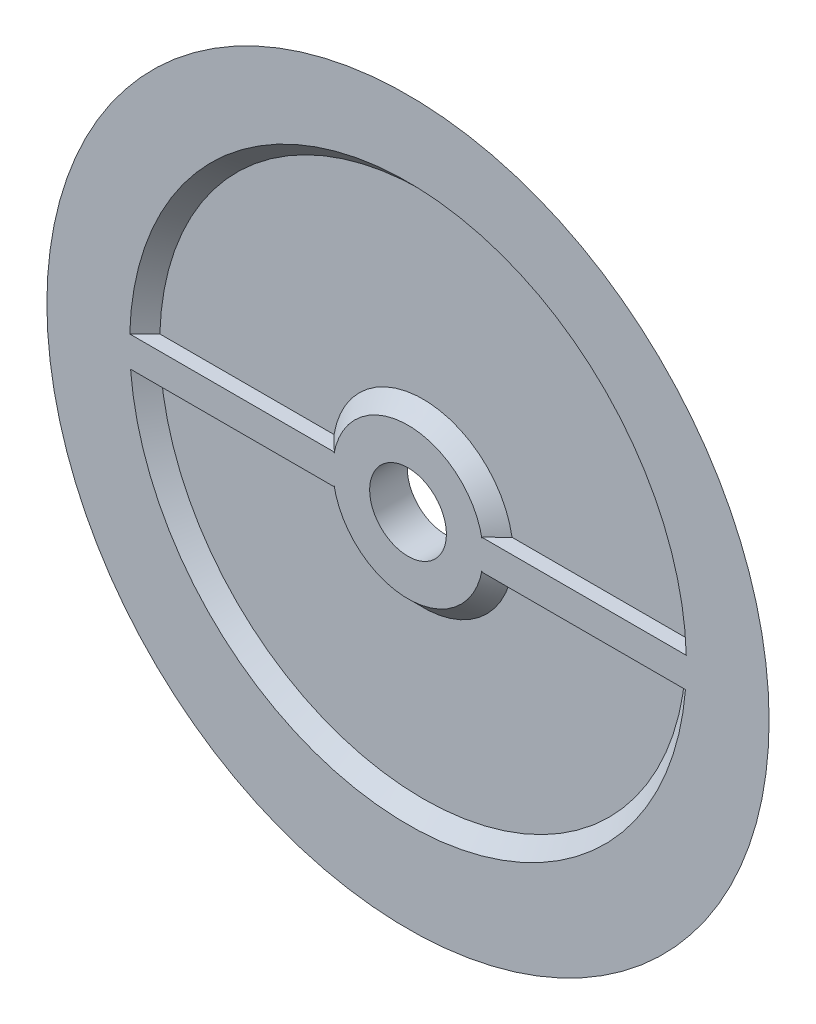
ISO-10303-21;
HEADER;
FILE_DESCRIPTION(('STEP AP214'),'2;1');
FILE_NAME('part.step','',(''),(''),'','','');
FILE_SCHEMA(('AUTOMOTIVE_DESIGN { 1 0 10303 214 1 1 1 1 }'));
ENDSEC;
DATA;
#1=APPLICATION_CONTEXT('core data for automotive mechanical design processes');
#2=APPLICATION_PROTOCOL_DEFINITION('international standard','automotive_design',2000,#1);
#3=PRODUCT_CONTEXT('',#1,'mechanical');
#4=PRODUCT('Part','Part','',(#3));
#5=PRODUCT_RELATED_PRODUCT_CATEGORY('part','',(#4));
#6=PRODUCT_DEFINITION_FORMATION('','',#4);
#7=PRODUCT_DEFINITION_CONTEXT('part definition',#1,'design');
#8=PRODUCT_DEFINITION('design','',#6,#7);
#9=PRODUCT_DEFINITION_SHAPE('','',#8);
#10=(LENGTH_UNIT() NAMED_UNIT(*) SI_UNIT(.MILLI.,.METRE.));
#11=(NAMED_UNIT(*) PLANE_ANGLE_UNIT() SI_UNIT($,.RADIAN.));
#12=(NAMED_UNIT(*) SI_UNIT($,.STERADIAN.) SOLID_ANGLE_UNIT());
#13=UNCERTAINTY_MEASURE_WITH_UNIT(LENGTH_MEASURE(1.E-05),#10,'distance_accuracy_value','');
#14=(GEOMETRIC_REPRESENTATION_CONTEXT(3) GLOBAL_UNCERTAINTY_ASSIGNED_CONTEXT((#13)) GLOBAL_UNIT_ASSIGNED_CONTEXT((#10,
#11,#12)) REPRESENTATION_CONTEXT('',''));
#15=CARTESIAN_POINT('',(0.,0.,0.));
#16=DIRECTION('',(0.,0.,1.));
#17=DIRECTION('',(1.,0.,0.));
#18=AXIS2_PLACEMENT_3D('',#15,#16,#17);
#19=CARTESIAN_POINT('',(0.,0.990500037260635,3.));
#20=DIRECTION('',(0.,0.,1.));
#21=DIRECTION('',(1.,0.,0.));
#22=AXIS2_PLACEMENT_3D('',#19,#20,#21);
#23=PLANE('',#22);
#24=CARTESIAN_POINT('',(0.,0.,3.));
#25=DIRECTION('',(0.,0.,1.));
#26=DIRECTION('',(1.,0.,0.));
#27=AXIS2_PLACEMENT_3D('',#24,#25,#26);
#28=CIRCLE('',#27,12.);
#29=CARTESIAN_POINT('',(11.8321595661992,2.,3.));
#30=VERTEX_POINT('',#29);
#31=CARTESIAN_POINT('',(-11.8321595661992,2.,3.));
#32=VERTEX_POINT('',#31);
#33=EDGE_CURVE('E260',#30,#32,#28,.T.);
#34=ORIENTED_EDGE('',*,*,#33,.F.);
#35=DIRECTION('',(-1.,0.,0.));
#36=VECTOR('',#35,1.);
#37=CARTESIAN_POINT('',(40.1870522877006,2.,3.));
#38=LINE('',#37,#36);
#39=CARTESIAN_POINT('',(34.9854385398444,2.,3.));
#40=VERTEX_POINT('',#39);
#41=EDGE_CURVE('E261',#40,#30,#38,.T.);
#42=ORIENTED_EDGE('',*,*,#41,.F.);
#43=CARTESIAN_POINT('',(0.,0.990500037260635,3.));
#44=DIRECTION('',(0.,0.,1.));
#45=DIRECTION('',(1.,0.,0.));
#46=AXIS2_PLACEMENT_3D('',#43,#44,#45);
#47=CIRCLE('',#46,35.);
#48=CARTESIAN_POINT('',(-34.9854385398444,2.,3.));
#49=VERTEX_POINT('',#48);
#50=EDGE_CURVE('E275',#40,#49,#47,.T.);
#51=ORIENTED_EDGE('',*,*,#50,.T.);
#52=DIRECTION('',(-1.,0.,0.));
#53=VECTOR('',#52,1.);
#54=CARTESIAN_POINT('',(-40.1870522877006,2.,3.));
#55=LINE('',#54,#53);
#56=EDGE_CURVE('E264',#32,#49,#55,.T.);
#57=ORIENTED_EDGE('',*,*,#56,.F.);
#58=EDGE_LOOP('',(#34,#42,#51,#57));
#59=FACE_BOUND('',#58,.T.);
#60=ADVANCED_FACE('F42',(#59),#23,.T.);
#61=DIRECTION('',(1.,0.,0.));
#62=VECTOR('',#61,1.);
#63=CARTESIAN_POINT('',(40.1870522877006,-2.,3.));
#64=LINE('',#63,#62);
#65=CARTESIAN_POINT('',(11.8321595661992,-2.,3.));
#66=VERTEX_POINT('',#65);
#67=CARTESIAN_POINT('',(34.8720075350867,-2.,3.));
#68=VERTEX_POINT('',#67);
#69=EDGE_CURVE('E149',#66,#68,#64,.T.);
#70=ORIENTED_EDGE('',*,*,#69,.F.);
#71=CARTESIAN_POINT('',(-11.8321595661992,-2.,3.));
#72=VERTEX_POINT('',#71);
#73=EDGE_CURVE('E266',#72,#66,#28,.T.);
#74=ORIENTED_EDGE('',*,*,#73,.F.);
#75=DIRECTION('',(1.,0.,0.));
#76=VECTOR('',#75,1.);
#77=CARTESIAN_POINT('',(0.,-2.,3.));
#78=LINE('',#77,#76);
#79=CARTESIAN_POINT('',(-34.8720075350867,-2.,3.));
#80=VERTEX_POINT('',#79);
#81=EDGE_CURVE('E298',#80,#72,#78,.T.);
#82=ORIENTED_EDGE('',*,*,#81,.F.);
#83=EDGE_CURVE('E271',#80,#68,#47,.T.);
#84=ORIENTED_EDGE('',*,*,#83,.T.);
#85=EDGE_LOOP('',(#70,#74,#82,#84));
#86=FACE_BOUND('',#85,.T.);
#87=ADVANCED_FACE('F252',(#86),#23,.T.);
#88=CARTESIAN_POINT('',(0.,0.,5.));
#89=DIRECTION('',(0.,0.,-1.));
#90=DIRECTION('',(1.,0.,0.));
#91=AXIS2_PLACEMENT_3D('',#88,#89,#90);
#92=CONICAL_SURFACE('',#91,10.,0.78539816339745);
#93=CARTESIAN_POINT('',(9.86606874731853,2.0007,4.93311800919394));
#94=CARTESIAN_POINT('',(9.86606874731853,1.87762100868135,4.95758139565382));
#95=CARTESIAN_POINT('',(9.86606874731853,1.7541331534907,4.97995191513057));
#96=CARTESIAN_POINT('',(9.86606874731853,1.50643487696366,5.02033423720103));
#97=CARTESIAN_POINT('',(9.86606874731853,1.38222438365299,5.03834559774242));
#98=CARTESIAN_POINT('',(9.86606874731853,1.00862713496209,5.0855824427051));
#99=CARTESIAN_POINT('',(9.86606874731853,0.758336164556195,5.10799830172327));
#100=CARTESIAN_POINT('',(9.86606874731853,0.260412570286895,5.13358357055511));
#101=CARTESIAN_POINT('',(9.86606874731853,0.0127936349844117,5.13702576053642));
#102=CARTESIAN_POINT('',(9.86606874731853,-0.481912365436169,5.12526103757676));
#103=CARTESIAN_POINT('',(9.86606874731853,-0.728999631073088,5.11006322041137));
#104=CARTESIAN_POINT('',(9.86606874731853,-1.06094967246736,5.07741962632327));
#105=CARTESIAN_POINT('',(9.86606874731853,-1.14665132476625,5.06788550236831));
#106=CARTESIAN_POINT('',(9.86606874731853,-1.3177811234612,5.04667566929113));
#107=CARTESIAN_POINT('',(9.86606874731853,-1.4032093017906,5.03500022023669));
#108=CARTESIAN_POINT('',(9.86606874731853,-1.65990219900183,4.99670985052405));
#109=CARTESIAN_POINT('',(9.86606874731853,-1.83070025528273,4.96691781238347));
#110=CARTESIAN_POINT('',(9.86606874731853,-2.0007,4.93311800919394));
#111=B_SPLINE_CURVE_WITH_KNOTS('',3,(#93,#94,#95,#96,#97,#98,#99,#100,#101,#102,#103,#104,#105,
#106,#107,#108,#109,#110),.UNSPECIFIED.,.F.,.F.,(4,2,2,2,2,2,2,2,4),(0.,0.376424725914337,
0.752887608217759,1.50600130008476,2.24825884012315,2.99015432435953,3.24882739921132,
3.50746907853298,4.02738740673174),.UNSPECIFIED.);
#112=CARTESIAN_POINT('',(9.86606874731853,2.,4.93325710436512));
#113=VERTEX_POINT('',#112);
#114=CARTESIAN_POINT('',(9.86606874731853,1.6311613878414,5.));
#115=VERTEX_POINT('',#114);
#116=EDGE_CURVE('E63',#113,#115,#111,.T.);
#117=ORIENTED_EDGE('',*,*,#116,.F.);
#118=CARTESIAN_POINT('',(6.94120422105731,2.,7.7764056011966));
#119=CARTESIAN_POINT('',(7.19546885130194,2.,7.53205034493387));
#120=CARTESIAN_POINT('',(7.44924991959591,2.,7.28719342031385));
#121=CARTESIAN_POINT('',(7.95604024694275,2.,6.79668377558951));
#122=CARTESIAN_POINT('',(8.20904950880184,2.,6.55103105838535));
#123=CARTESIAN_POINT('',(8.71449120418471,2.,6.05913771126599));
#124=CARTESIAN_POINT('',(8.96692364267012,2.,5.81289708644531));
#125=CARTESIAN_POINT('',(9.47133536064413,2.,5.31995169581107));
#126=CARTESIAN_POINT('',(9.723314639656,2.,5.0732469295098));
#127=CARTESIAN_POINT('',(10.478711340777,2.,4.332595092473));
#128=CARTESIAN_POINT('',(10.9815947907177,2.,3.83810350009271));
#129=CARTESIAN_POINT('',(11.9864249485371,2.,2.8481681249572));
#130=CARTESIAN_POINT('',(12.4883716544895,2.,2.35272434024796));
#131=CARTESIAN_POINT('',(13.2902421104832,2.,1.56019124084595));
#132=CARTESIAN_POINT('',(13.5903770049907,2.,1.26331550036275));
#133=CARTESIAN_POINT('',(14.1904516816206,2.,0.669364668411167));
#134=CARTESIAN_POINT('',(14.4903914630176,2.,0.372289576210017));
#135=CARTESIAN_POINT('',(14.7902529095094,2.,0.0751354737387822));
#136=B_SPLINE_CURVE_WITH_KNOTS('',3,(#118,#119,#120,#121,#122,#123,#124,#125,#126,#127,#128,
#129,#130,#131,#132,#133,#134,#135),.UNSPECIFIED.,.F.,.F.,(4,2,2,2,2,2,2,2,4),(0.,
1.0579391871005,2.1158745230247,3.17380072441809,4.23172803808931,6.34755265226564,
8.46338161301056,9.72985120305247,10.9963254741789),.UNSPECIFIED.);
#137=EDGE_CURVE('E159',#113,#30,#136,.T.);
#138=ORIENTED_EDGE('',*,*,#137,.T.);
#139=ORIENTED_EDGE('',*,*,#33,.T.);
#140=CARTESIAN_POINT('',(-14.7902529095094,2.,0.0751354737387808));
#141=CARTESIAN_POINT('',(-14.4648057626749,2.,0.397645870526155));
#142=CARTESIAN_POINT('',(-14.1392651718074,2.,0.720061904083509));
#143=CARTESIAN_POINT('',(-13.4879485918217,2.,1.36465661173277));
#144=CARTESIAN_POINT('',(-13.1621726025211,2.,1.68683528564031));
#145=CARTESIAN_POINT('',(-12.1844273564708,2.,2.65293383377169));
#146=CARTESIAN_POINT('',(-11.5320330080341,2.,3.29642398208027));
#147=CARTESIAN_POINT('',(-10.5520463287102,2.,4.26024876107751));
#148=CARTESIAN_POINT('',(-10.225149598952,2.,4.58129054689983));
#149=CARTESIAN_POINT('',(-9.57073689132727,2.,5.22274149076365));
#150=CARTESIAN_POINT('',(-9.24322091446114,2.,5.54315064982546));
#151=CARTESIAN_POINT('',(-8.5873501322931,2.,6.1831178250344));
#152=CARTESIAN_POINT('',(-8.25899531702639,2.,6.50267583097744));
#153=CARTESIAN_POINT('',(-7.76558220964641,2.,6.98110629424619));
#154=CARTESIAN_POINT('',(-7.60096391153486,2.,7.14043245583454));
#155=CARTESIAN_POINT('',(-7.27136895911861,2.,7.45871415821596));
#156=CARTESIAN_POINT('',(-7.10639230424502,2.,7.61766969841981));
#157=CARTESIAN_POINT('',(-6.9412042210573,2.,7.7764056011966));
#158=B_SPLINE_CURVE_WITH_KNOTS('',3,(#140,#141,#142,#143,#144,#145,#146,#147,#148,#149,#150,
#151,#152,#153,#154,#155,#156,#157),.UNSPECIFIED.,.F.,.F.,(4,2,2,2,2,2,2,2,4),(0.,
1.37453949503144,2.74908005661718,5.49812816919584,6.87266881774801,8.24720724761188,
9.6217620826709,10.3090432330112,10.9963254752235),.UNSPECIFIED.);
#159=CARTESIAN_POINT('',(-9.86606874731853,2.,4.93325710436512));
#160=VERTEX_POINT('',#159);
#161=EDGE_CURVE('E329',#32,#160,#158,.T.);
#162=ORIENTED_EDGE('',*,*,#161,.T.);
#163=CARTESIAN_POINT('',(-9.86606874731853,-2.0007,4.93311800919394));
#164=CARTESIAN_POINT('',(-9.86606874731853,-1.87762100868135,4.95758139565382));
#165=CARTESIAN_POINT('',(-9.86606874731853,-1.7541331534907,4.97995191513057));
#166=CARTESIAN_POINT('',(-9.86606874731853,-1.50643487696366,5.02033423720103));
#167=CARTESIAN_POINT('',(-9.86606874731853,-1.38222438365299,5.03834559774242));
#168=CARTESIAN_POINT('',(-9.86606874731853,-1.00862713496209,5.0855824427051));
#169=CARTESIAN_POINT('',(-9.86606874731853,-0.758336164556195,5.10799830172327));
#170=CARTESIAN_POINT('',(-9.86606874731853,-0.260412570286895,5.13358357055511));
#171=CARTESIAN_POINT('',(-9.86606874731853,-0.0127936349844117,5.13702576053642));
#172=CARTESIAN_POINT('',(-9.86606874731853,0.481912365436169,5.12526103757676));
#173=CARTESIAN_POINT('',(-9.86606874731853,0.728999631073088,5.11006322041137));
#174=CARTESIAN_POINT('',(-9.86606874731853,1.06094967246736,5.07741962632327));
#175=CARTESIAN_POINT('',(-9.86606874731853,1.14665132476625,5.06788550236831));
#176=CARTESIAN_POINT('',(-9.86606874731853,1.3177811234612,5.04667566929113));
#177=CARTESIAN_POINT('',(-9.86606874731853,1.4032093017906,5.03500022023669));
#178=CARTESIAN_POINT('',(-9.86606874731853,1.65990219900183,4.99670985052405));
#179=CARTESIAN_POINT('',(-9.86606874731853,1.83070025528273,4.96691781238347));
#180=CARTESIAN_POINT('',(-9.86606874731853,2.0007,4.93311800919394));
#181=B_SPLINE_CURVE_WITH_KNOTS('',3,(#163,#164,#165,#166,#167,#168,#169,#170,#171,#172,#173,
#174,#175,#176,#177,#178,#179,#180),.UNSPECIFIED.,.F.,.F.,(4,2,2,2,2,2,2,2,4),(0.,
0.376424725914337,0.752887608217759,1.50600130008476,2.24825884012315,2.99015432435953,
3.24882739921132,3.50746907853298,4.02738740673174),.UNSPECIFIED.);
#182=CARTESIAN_POINT('',(-9.86606874731853,1.6311613878414,5.));
#183=VERTEX_POINT('',#182);
#184=EDGE_CURVE('E204',#183,#160,#181,.T.);
#185=ORIENTED_EDGE('',*,*,#184,.F.);
#186=CARTESIAN_POINT('',(0.,0.,5.));
#187=DIRECTION('',(0.,0.,1.));
#188=DIRECTION('',(1.,0.,0.));
#189=AXIS2_PLACEMENT_3D('',#186,#187,#188);
#190=CIRCLE('',#189,10.);
#191=EDGE_CURVE('E238',#115,#183,#190,.T.);
#192=ORIENTED_EDGE('',*,*,#191,.F.);
#193=EDGE_LOOP('',(#117,#138,#139,#162,#185,#192));
#194=FACE_BOUND('',#193,.T.);
#195=ADVANCED_FACE('F179',(#194),#92,.T.);
#196=ORIENTED_EDGE('',*,*,#73,.T.);
#197=CARTESIAN_POINT('',(14.7902529095094,-2.,0.0751354737387808));
#198=CARTESIAN_POINT('',(14.4648057626749,-2.,0.397645870526155));
#199=CARTESIAN_POINT('',(14.1392651718074,-2.,0.720061904083509));
#200=CARTESIAN_POINT('',(13.4879485918217,-2.,1.36465661173277));
#201=CARTESIAN_POINT('',(13.1621726025211,-2.,1.68683528564031));
#202=CARTESIAN_POINT('',(12.1844273564708,-2.,2.65293383377169));
#203=CARTESIAN_POINT('',(11.5320330080341,-2.,3.29642398208027));
#204=CARTESIAN_POINT('',(10.5520463287102,-2.,4.26024876107751));
#205=CARTESIAN_POINT('',(10.225149598952,-2.,4.58129054689983));
#206=CARTESIAN_POINT('',(9.57073689132727,-2.,5.22274149076365));
#207=CARTESIAN_POINT('',(9.24322091446114,-2.,5.54315064982546));
#208=CARTESIAN_POINT('',(8.5873501322931,-2.,6.1831178250344));
#209=CARTESIAN_POINT('',(8.25899531702639,-2.,6.50267583097744));
#210=CARTESIAN_POINT('',(7.76558220964641,-2.,6.98110629424619));
#211=CARTESIAN_POINT('',(7.60096391153486,-2.,7.14043245583454));
#212=CARTESIAN_POINT('',(7.27136895911861,-2.,7.45871415821596));
#213=CARTESIAN_POINT('',(7.10639230424502,-2.,7.61766969841981));
#214=CARTESIAN_POINT('',(6.9412042210573,-2.,7.7764056011966));
#215=B_SPLINE_CURVE_WITH_KNOTS('',3,(#197,#198,#199,#200,#201,#202,#203,#204,#205,#206,#207,
#208,#209,#210,#211,#212,#213,#214),.UNSPECIFIED.,.F.,.F.,(4,2,2,2,2,2,2,2,4),(0.,
1.37453949503144,2.74908005661718,5.49812816919584,6.87266881774801,8.24720724761188,
9.6217620826709,10.3090432330112,10.9963254752235),.UNSPECIFIED.);
#216=CARTESIAN_POINT('',(9.86606874731853,-2.,4.93325710436512));
#217=VERTEX_POINT('',#216);
#218=EDGE_CURVE('E71',#66,#217,#215,.T.);
#219=ORIENTED_EDGE('',*,*,#218,.T.);
#220=CARTESIAN_POINT('',(9.86606874731853,-1.6311613878414,5.));
#221=VERTEX_POINT('',#220);
#222=EDGE_CURVE('E525',#221,#217,#111,.T.);
#223=ORIENTED_EDGE('',*,*,#222,.F.);
#224=CARTESIAN_POINT('',(-9.86606874731853,-1.6311613878414,5.));
#225=VERTEX_POINT('',#224);
#226=EDGE_CURVE('E239',#225,#221,#190,.T.);
#227=ORIENTED_EDGE('',*,*,#226,.F.);
#228=CARTESIAN_POINT('',(-9.86606874731853,-2.,4.93325710436512));
#229=VERTEX_POINT('',#228);
#230=EDGE_CURVE('E203',#229,#225,#181,.T.);
#231=ORIENTED_EDGE('',*,*,#230,.F.);
#232=CARTESIAN_POINT('',(-6.94120422105731,-2.,7.7764056011966));
#233=CARTESIAN_POINT('',(-7.19546885130194,-2.,7.53205034493387));
#234=CARTESIAN_POINT('',(-7.44924991959591,-2.,7.28719342031385));
#235=CARTESIAN_POINT('',(-7.95604024694275,-2.,6.79668377558951));
#236=CARTESIAN_POINT('',(-8.20904950880184,-2.,6.55103105838535));
#237=CARTESIAN_POINT('',(-8.71449120418471,-2.,6.05913771126599));
#238=CARTESIAN_POINT('',(-8.96692364267012,-2.,5.81289708644531));
#239=CARTESIAN_POINT('',(-9.47133536064413,-2.,5.31995169581107));
#240=CARTESIAN_POINT('',(-9.723314639656,-2.,5.0732469295098));
#241=CARTESIAN_POINT('',(-10.478711340777,-2.,4.332595092473));
#242=CARTESIAN_POINT('',(-10.9815947907177,-2.,3.83810350009271));
#243=CARTESIAN_POINT('',(-11.9864249485371,-2.,2.8481681249572));
#244=CARTESIAN_POINT('',(-12.4883716544895,-2.,2.35272434024796));
#245=CARTESIAN_POINT('',(-13.2902421104832,-2.,1.56019124084595));
#246=CARTESIAN_POINT('',(-13.5903770049907,-2.,1.26331550036275));
#247=CARTESIAN_POINT('',(-14.1904516816206,-2.,0.669364668411167));
#248=CARTESIAN_POINT('',(-14.4903914630176,-2.,0.372289576210017));
#249=CARTESIAN_POINT('',(-14.7902529095094,-2.,0.0751354737387822));
#250=B_SPLINE_CURVE_WITH_KNOTS('',3,(#232,#233,#234,#235,#236,#237,#238,#239,#240,#241,#242,
#243,#244,#245,#246,#247,#248,#249),.UNSPECIFIED.,.F.,.F.,(4,2,2,2,2,2,2,2,4),(0.,
1.0579391871005,2.1158745230247,3.17380072441809,4.23172803808931,6.34755265226564,
8.46338161301056,9.72985120305247,10.9963254741789),.UNSPECIFIED.);
#251=EDGE_CURVE('E335',#229,#72,#250,.T.);
#252=ORIENTED_EDGE('',*,*,#251,.T.);
#253=EDGE_LOOP('',(#196,#219,#223,#227,#231,#252));
#254=FACE_BOUND('',#253,.T.);
#255=ADVANCED_FACE('F427',(#254),#92,.T.);
#256=CARTESIAN_POINT('',(0.,0.990500037260635,5.));
#257=DIRECTION('',(0.,0.,1.));
#258=DIRECTION('',(1.,0.,0.));
#259=AXIS2_PLACEMENT_3D('',#256,#257,#258);
#260=CONICAL_SURFACE('',#259,37.,0.78539816339745);
#261=ORIENTED_EDGE('',*,*,#50,.F.);
#262=CARTESIAN_POINT('',(12.73574703427,2.,-19.2243065669338));
#263=CARTESIAN_POINT('',(13.6190836930958,2.,-18.343689417314));
#264=CARTESIAN_POINT('',(14.5021805172993,2.,-17.4628318264621));
#265=CARTESIAN_POINT('',(16.2680391078315,2.,-15.7007809584659));
#266=CARTESIAN_POINT('',(17.150800874182,2.,-14.8195876813432));
#267=CARTESIAN_POINT('',(19.7988005636949,2.,-12.1757220548174));
#268=CARTESIAN_POINT('',(21.5637529881943,2.,-10.4127637996499));
#269=CARTESIAN_POINT('',(26.3199792466651,2.,-5.66098789629385));
#270=CARTESIAN_POINT('',(29.3109320522761,2.,-2.67184895927616));
#271=CARTESIAN_POINT('',(35.2924721523931,2.,3.30679458105969));
#272=CARTESIAN_POINT('',(38.2830594468978,2.,6.29629918437913));
#273=CARTESIAN_POINT('',(44.2640479695494,2.,12.2754956580293));
#274=CARTESIAN_POINT('',(47.2544491976607,2.,15.2651875283958));
#275=CARTESIAN_POINT('',(53.235140356528,2.,21.244682481809));
#276=CARTESIAN_POINT('',(56.2254302872861,2.,24.2344855648537));
#277=CARTESIAN_POINT('',(59.2157022938966,2.,27.2243065669338));
#278=B_SPLINE_CURVE_WITH_KNOTS('',3,(#262,#263,#264,#265,#266,#267,#268,#269,#270,#271,#272,
#273,#274,#275,#276,#277),.UNSPECIFIED.,.F.,.F.,(4,2,2,2,2,2,2,4),(0.,3.74191536575073,
7.48383048989927,14.9676602683624,27.6533510273809,40.3390418305382,53.0247350605915,
65.710428061829),.UNSPECIFIED.);
#279=CARTESIAN_POINT('',(36.9862259473068,2.,5.));
#280=VERTEX_POINT('',#279);
#281=EDGE_CURVE('E12',#40,#280,#278,.T.);
#282=ORIENTED_EDGE('',*,*,#281,.T.);
#283=CARTESIAN_POINT('',(0.,0.990500037260635,5.));
#284=DIRECTION('',(0.,0.,1.));
#285=DIRECTION('',(1.,0.,0.));
#286=AXIS2_PLACEMENT_3D('',#283,#284,#285);
#287=CIRCLE('',#286,37.);
#288=CARTESIAN_POINT('',(-36.9862259473068,2.,5.));
#289=VERTEX_POINT('',#288);
#290=EDGE_CURVE('E145',#280,#289,#287,.T.);
#291=ORIENTED_EDGE('',*,*,#290,.T.);
#292=CARTESIAN_POINT('',(-59.2157022938966,2.,27.2243065669338));
#293=CARTESIAN_POINT('',(-57.2795486982274,2.,25.2884361816818));
#294=CARTESIAN_POINT('',(-55.3433831158808,2.,23.352577784267));
#295=CARTESIAN_POINT('',(-51.4710139224122,2.,19.4808990633633));
#296=CARTESIAN_POINT('',(-49.5348103112906,2.,17.5450787398741));
#297=CARTESIAN_POINT('',(-45.6623510603674,2.,13.6734903205725));
#298=CARTESIAN_POINT('',(-43.7260954205684,2.,11.7377222247577));
#299=CARTESIAN_POINT('',(-39.853507209818,2.,7.86626294671828));
#300=CARTESIAN_POINT('',(-37.917174638866,2.,5.93057176449449));
#301=CARTESIAN_POINT('',(-34.044389066336,2.,2.05930954889864));
#302=CARTESIAN_POINT('',(-32.1079360647478,2.,0.123738515536771));
#303=CARTESIAN_POINT('',(-28.2348309426523,2.,-3.74720424262224));
#304=CARTESIAN_POINT('',(-26.2981788221496,2.,-5.68257596742407));
#305=CARTESIAN_POINT('',(-23.3929144970141,2.,-8.58534735702498));
#306=CARTESIAN_POINT('',(-22.4244453191152,2.,-9.55289016602489));
#307=CARTESIAN_POINT('',(-20.4873625939516,2.,-11.4878312196055));
#308=CARTESIAN_POINT('',(-19.5187490466894,2.,-12.4552294641888));
#309=CARTESIAN_POINT('',(-17.5813104084528,2.,-14.3898143082444));
#310=CARTESIAN_POINT('',(-16.6124853174595,2.,-15.3570009076978));
#311=CARTESIAN_POINT('',(-14.6744492081255,2.,-17.2909874709202));
#312=CARTESIAN_POINT('',(-13.7052381897602,2.,-18.2577874346645));
#313=CARTESIAN_POINT('',(-12.73574703427,2.,-19.2243065669338));
#314=B_SPLINE_CURVE_WITH_KNOTS('',3,(#292,#293,#294,#295,#296,#297,#298,#299,#300,#301,#302,
#303,#304,#305,#306,#307,#308,#309,#310,#311,#312,#313),.UNSPECIFIED.,.F.,.F.,(4,2,2,2,2,2,2,2,
2,2,4),(0.,8.21380326405149,16.4276064469139,24.6414092318991,32.8552120991419,41.0690156627669,
49.282819033433,53.3897211042386,57.4966231030727,61.603525467495,65.7104280925904),.UNSPECIFIED.);
#315=EDGE_CURVE('E222',#289,#49,#314,.T.);
#316=ORIENTED_EDGE('',*,*,#315,.T.);
#317=EDGE_LOOP('',(#261,#282,#291,#316));
#318=FACE_BOUND('',#317,.T.);
#319=ADVANCED_FACE('F217',(#318),#260,.F.);
#320=CARTESIAN_POINT('',(0.,0.,5.));
#321=DIRECTION('',(0.,0.,1.));
#322=DIRECTION('',(1.,0.,0.));
#323=AXIS2_PLACEMENT_3D('',#320,#321,#322);
#324=PLANE('',#323);
#325=DIRECTION('',(0.,1.,0.));
#326=VECTOR('',#325,1.);
#327=CARTESIAN_POINT('',(9.86606874731853,-2.,5.));
#328=LINE('',#327,#326);
#329=CARTESIAN_POINT('',(9.86606874731853,2.,5.));
#330=VERTEX_POINT('',#329);
#331=EDGE_CURVE('E143',#115,#330,#328,.T.);
#332=ORIENTED_EDGE('',*,*,#331,.F.);
#333=ORIENTED_EDGE('',*,*,#191,.T.);
#334=DIRECTION('',(0.,-1.,0.));
#335=VECTOR('',#334,1.);
#336=CARTESIAN_POINT('',(-9.86606874731853,2.,5.));
#337=LINE('',#336,#335);
#338=CARTESIAN_POINT('',(-9.86606874731853,2.,5.));
#339=VERTEX_POINT('',#338);
#340=EDGE_CURVE('E321',#339,#183,#337,.T.);
#341=ORIENTED_EDGE('',*,*,#340,.F.);
#342=DIRECTION('',(-1.,0.,0.));
#343=VECTOR('',#342,1.);
#344=CARTESIAN_POINT('',(-40.1870522877006,2.,5.));
#345=LINE('',#344,#343);
#346=EDGE_CURVE('E342',#339,#289,#345,.T.);
#347=ORIENTED_EDGE('',*,*,#346,.T.);
#348=ORIENTED_EDGE('',*,*,#290,.F.);
#349=DIRECTION('',(-1.,0.,0.));
#350=VECTOR('',#349,1.);
#351=CARTESIAN_POINT('',(40.1870522877006,2.,5.));
#352=LINE('',#351,#350);
#353=EDGE_CURVE('E139',#280,#330,#352,.T.);
#354=ORIENTED_EDGE('',*,*,#353,.T.);
#355=EDGE_LOOP('',(#332,#333,#341,#347,#348,#354));
#356=FACE_BOUND('',#355,.T.);
#357=ORIENTED_EDGE('',*,*,#226,.T.);
#358=CARTESIAN_POINT('',(9.86606874731853,-2.,5.));
#359=VERTEX_POINT('',#358);
#360=EDGE_CURVE('E156',#359,#221,#328,.T.);
#361=ORIENTED_EDGE('',*,*,#360,.F.);
#362=DIRECTION('',(1.,0.,0.));
#363=VECTOR('',#362,1.);
#364=CARTESIAN_POINT('',(40.1870522877006,-2.,5.));
#365=LINE('',#364,#363);
#366=CARTESIAN_POINT('',(36.878949409211,-2.,5.));
#367=VERTEX_POINT('',#366);
#368=EDGE_CURVE('E150',#359,#367,#365,.T.);
#369=ORIENTED_EDGE('',*,*,#368,.T.);
#370=CARTESIAN_POINT('',(-36.878949409211,-2.,5.));
#371=VERTEX_POINT('',#370);
#372=EDGE_CURVE('E270',#371,#367,#287,.T.);
#373=ORIENTED_EDGE('',*,*,#372,.F.);
#374=DIRECTION('',(1.,0.,0.));
#375=VECTOR('',#374,1.);
#376=CARTESIAN_POINT('',(-40.1870522877006,-2.,5.));
#377=LINE('',#376,#375);
#378=CARTESIAN_POINT('',(-9.86606874731853,-2.,5.));
#379=VERTEX_POINT('',#378);
#380=EDGE_CURVE('E320',#371,#379,#377,.T.);
#381=ORIENTED_EDGE('',*,*,#380,.T.);
#382=EDGE_CURVE('E313',#225,#379,#337,.T.);
#383=ORIENTED_EDGE('',*,*,#382,.F.);
#384=EDGE_LOOP('',(#357,#361,#369,#373,#381,#383));
#385=FACE_BOUND('',#384,.T.);
#386=CARTESIAN_POINT('',(0.,0.,5.));
#387=DIRECTION('',(0.,0.,-1.));
#388=DIRECTION('',(-1.,0.,0.));
#389=AXIS2_PLACEMENT_3D('',#386,#387,#388);
#390=CIRCLE('',#389,48.);
#391=CARTESIAN_POINT('',(-48.,0.,5.));
#392=VERTEX_POINT('',#391);
#393=EDGE_CURVE('E290',#392,#392,#390,.T.);
#394=ORIENTED_EDGE('',*,*,#393,.F.);
#395=EDGE_LOOP('',(#394));
#396=FACE_BOUND('',#395,.T.);
#397=CARTESIAN_POINT('',(0.,0.,5.));
#398=DIRECTION('',(0.,0.,-1.));
#399=DIRECTION('',(-1.,0.,0.));
#400=AXIS2_PLACEMENT_3D('',#397,#398,#399);
#401=CIRCLE('',#400,5.1);
#402=CARTESIAN_POINT('',(-5.1,0.,5.));
#403=VERTEX_POINT('',#402);
#404=EDGE_CURVE('E276',#403,#403,#401,.T.);
#405=ORIENTED_EDGE('',*,*,#404,.T.);
#406=EDGE_LOOP('',(#405));
#407=FACE_BOUND('',#406,.T.);
#408=ADVANCED_FACE('F141',(#356,#385,#396,#407),#324,.T.);
#409=CARTESIAN_POINT('',(0.,0.,0.));
#410=DIRECTION('',(0.,0.,1.));
#411=DIRECTION('',(1.,0.,0.));
#412=AXIS2_PLACEMENT_3D('',#409,#410,#411);
#413=CONICAL_SURFACE('',#412,37.,1.14416883366802);
#414=ORIENTED_EDGE('',*,*,#393,.T.);
#415=EDGE_LOOP('',(#414));
#416=FACE_BOUND('',#415,.T.);
#417=CARTESIAN_POINT('',(0.,0.,0.));
#418=DIRECTION('',(0.,0.,1.));
#419=DIRECTION('',(1.,0.,0.));
#420=AXIS2_PLACEMENT_3D('',#417,#418,#419);
#421=CIRCLE('',#420,37.);
#422=CARTESIAN_POINT('',(37.,0.,0.));
#423=VERTEX_POINT('',#422);
#424=EDGE_CURVE('E293',#423,#423,#421,.T.);
#425=ORIENTED_EDGE('',*,*,#424,.T.);
#426=EDGE_LOOP('',(#425));
#427=FACE_BOUND('',#426,.T.);
#428=ADVANCED_FACE('F409',(#416,#427),#413,.T.);
#429=CARTESIAN_POINT('',(0.,0.,0.));
#430=DIRECTION('',(0.,0.,1.));
#431=DIRECTION('',(1.,0.,0.));
#432=AXIS2_PLACEMENT_3D('',#429,#430,#431);
#433=PLANE('',#432);
#434=CARTESIAN_POINT('',(0.,0.,0.));
#435=DIRECTION('',(0.,0.,1.));
#436=DIRECTION('',(1.,0.,0.));
#437=AXIS2_PLACEMENT_3D('',#434,#435,#436);
#438=CIRCLE('',#437,34.4);
#439=CARTESIAN_POINT('',(34.4,0.,0.));
#440=VERTEX_POINT('',#439);
#441=EDGE_CURVE('E296',#440,#440,#438,.F.);
#442=ORIENTED_EDGE('',*,*,#441,.F.);
#443=EDGE_LOOP('',(#442));
#444=FACE_BOUND('',#443,.T.);
#445=ORIENTED_EDGE('',*,*,#424,.F.);
#446=EDGE_LOOP('',(#445));
#447=FACE_BOUND('',#446,.T.);
#448=ADVANCED_FACE('F44',(#444,#447),#433,.F.);
#449=CARTESIAN_POINT('',(0.,0.,-0.8));
#450=DIRECTION('',(0.,0.,-1.));
#451=DIRECTION('',(-1.,0.,0.));
#452=AXIS2_PLACEMENT_3D('',#449,#450,#451);
#453=PLANE('',#452);
#454=CARTESIAN_POINT('',(0.,0.,-0.8));
#455=DIRECTION('',(0.,0.,-1.));
#456=DIRECTION('',(-1.,0.,0.));
#457=AXIS2_PLACEMENT_3D('',#454,#455,#456);
#458=CIRCLE('',#457,34.4);
#459=CARTESIAN_POINT('',(-34.4,0.,-0.8));
#460=VERTEX_POINT('',#459);
#461=EDGE_CURVE('E285',#460,#460,#458,.T.);
#462=ORIENTED_EDGE('',*,*,#461,.T.);
#463=EDGE_LOOP('',(#462));
#464=FACE_BOUND('',#463,.T.);
#465=CARTESIAN_POINT('',(0.,0.,-0.8));
#466=DIRECTION('',(0.,0.,-1.));
#467=DIRECTION('',(-1.,0.,0.));
#468=AXIS2_PLACEMENT_3D('',#465,#466,#467);
#469=CIRCLE('',#468,30.4);
#470=CARTESIAN_POINT('',(-30.4,0.,-0.8));
#471=VERTEX_POINT('',#470);
#472=EDGE_CURVE('E282',#471,#471,#469,.T.);
#473=ORIENTED_EDGE('',*,*,#472,.F.);
#474=EDGE_LOOP('',(#473));
#475=FACE_BOUND('',#474,.T.);
#476=ADVANCED_FACE('F394',(#464,#475),#453,.T.);
#477=CARTESIAN_POINT('',(0.,0.,-0.8));
#478=DIRECTION('',(0.,0.,1.));
#479=DIRECTION('',(1.,0.,0.));
#480=AXIS2_PLACEMENT_3D('',#477,#478,#479);
#481=CYLINDRICAL_SURFACE('',#480,34.4);
#482=ORIENTED_EDGE('',*,*,#461,.F.);
#483=EDGE_LOOP('',(#482));
#484=FACE_BOUND('',#483,.T.);
#485=ORIENTED_EDGE('',*,*,#441,.T.);
#486=EDGE_LOOP('',(#485));
#487=FACE_BOUND('',#486,.T.);
#488=ADVANCED_FACE('F387',(#484,#487),#481,.T.);
#489=CARTESIAN_POINT('',(0.,0.,-0.8));
#490=DIRECTION('',(0.,0.,1.));
#491=DIRECTION('',(1.,0.,0.));
#492=AXIS2_PLACEMENT_3D('',#489,#490,#491);
#493=CYLINDRICAL_SURFACE('',#492,30.4);
#494=ORIENTED_EDGE('',*,*,#472,.T.);
#495=EDGE_LOOP('',(#494));
#496=FACE_BOUND('',#495,.T.);
#497=CARTESIAN_POINT('',(0.,0.,0.));
#498=DIRECTION('',(0.,0.,-1.));
#499=DIRECTION('',(-1.,0.,0.));
#500=AXIS2_PLACEMENT_3D('',#497,#498,#499);
#501=CIRCLE('',#500,30.4);
#502=CARTESIAN_POINT('',(-30.4,0.,0.));
#503=VERTEX_POINT('',#502);
#504=EDGE_CURVE('E279',#503,#503,#501,.T.);
#505=ORIENTED_EDGE('',*,*,#504,.F.);
#506=EDGE_LOOP('',(#505));
#507=FACE_BOUND('',#506,.T.);
#508=ADVANCED_FACE('F380',(#496,#507),#493,.F.);
#509=CARTESIAN_POINT('',(0.,0.,0.));
#510=DIRECTION('',(0.,0.,-1.));
#511=DIRECTION('',(-1.,0.,0.));
#512=AXIS2_PLACEMENT_3D('',#509,#510,#511);
#513=CIRCLE('',#512,5.1);
#514=CARTESIAN_POINT('',(-5.1,0.,0.));
#515=VERTEX_POINT('',#514);
#516=EDGE_CURVE('E274',#515,#515,#513,.T.);
#517=ORIENTED_EDGE('',*,*,#516,.F.);
#518=EDGE_LOOP('',(#517));
#519=FACE_BOUND('',#518,.T.);
#520=ORIENTED_EDGE('',*,*,#504,.T.);
#521=EDGE_LOOP('',(#520));
#522=FACE_BOUND('',#521,.T.);
#523=ADVANCED_FACE('F373',(#519,#522),#433,.F.);
#524=CARTESIAN_POINT('',(0.,0.,5.));
#525=DIRECTION('',(0.,0.,-1.));
#526=DIRECTION('',(-1.,0.,0.));
#527=AXIS2_PLACEMENT_3D('',#524,#525,#526);
#528=CYLINDRICAL_SURFACE('',#527,5.1);
#529=ORIENTED_EDGE('',*,*,#404,.F.);
#530=EDGE_LOOP('',(#529));
#531=FACE_BOUND('',#530,.T.);
#532=ORIENTED_EDGE('',*,*,#516,.T.);
#533=EDGE_LOOP('',(#532));
#534=FACE_BOUND('',#533,.T.);
#535=ADVANCED_FACE('F215',(#531,#534),#528,.F.);
#536=ORIENTED_EDGE('',*,*,#372,.T.);
#537=CARTESIAN_POINT('',(59.1487565199921,-2.,27.2243065669338));
#538=CARTESIAN_POINT('',(57.2063176637607,-2.,25.2843629488355));
#539=CARTESIAN_POINT('',(55.263773226031,-2.,23.34452499982));
#540=CARTESIAN_POINT('',(51.3783495068703,-2.,19.4651875869618));
#541=CARTESIAN_POINT('',(49.4354702257084,-2.,17.5256881228494));
#542=CARTESIAN_POINT('',(45.5492575491202,-2.,13.6471592252722));
#543=CARTESIAN_POINT('',(43.6059241554801,-2.,11.7081297900178));
#544=CARTESIAN_POINT('',(39.7185756413234,-2.,7.83075114740551));
#545=CARTESIAN_POINT('',(37.7745605202565,-2.,5.89240194059927));
#546=CARTESIAN_POINT('',(34.857726316761,-2.,2.9856790777287));
#547=CARTESIAN_POINT('',(33.8853096498168,-2.,2.01690161781937));
#548=CARTESIAN_POINT('',(31.9401268849018,-2.,0.0796978172324839));
#549=CARTESIAN_POINT('',(30.9673607869802,-2.,-0.888728523494509));
#550=CARTESIAN_POINT('',(29.0213712973273,-2.,-2.82511768529967));
#551=CARTESIAN_POINT('',(28.0481479065387,-2.,-3.79308050732511));
#552=CARTESIAN_POINT('',(26.101078909126,-2.,-5.72838127233008));
#553=CARTESIAN_POINT('',(25.1272333021778,-2.,-6.69571921498365));
#554=CARTESIAN_POINT('',(23.1786630645296,-2.,-8.62952361374417));
#555=CARTESIAN_POINT('',(22.2039384275021,-2.,-9.59599006347608));
#556=CARTESIAN_POINT('',(20.2532229365102,-2.,-11.527642168519));
#557=CARTESIAN_POINT('',(19.2772320843655,-2.,-12.4928278256668));
#558=CARTESIAN_POINT('',(17.811760554924,-2.,-13.9391091212431));
#559=CARTESIAN_POINT('',(17.3230206049239,-2.,-14.4209552205407));
#560=CARTESIAN_POINT('',(16.3449008003822,-2.,-15.3839969852959));
#561=CARTESIAN_POINT('',(15.8555209462322,-2.,-15.8651926511513));
#562=CARTESIAN_POINT('',(14.8759338789286,-2.,-16.8267464462922));
#563=CARTESIAN_POINT('',(14.3857266617066,-2.,-17.3071045714355));
#564=CARTESIAN_POINT('',(13.4041741328666,-2.,-18.2666584622831));
#565=CARTESIAN_POINT('',(12.9128288188388,-2.,-18.7458542255217));
#566=CARTESIAN_POINT('',(12.4207589229818,-2.,-19.2243065669338));
#567=B_SPLINE_CURVE_WITH_KNOTS('',3,(#537,#538,#539,#540,#541,#542,#543,#544,#545,#546,#547,
#548,#549,#550,#551,#552,#553,#554,#555,#556,#557,#558,#559,#560,#561,#562,#563,#564,#565,#566),
.UNSPECIFIED.,.F.,.F.,(4,2,2,2,2,2,2,2,2,2,2,2,2,2,4),(0.,8.235778674748,16.4715507597418,
24.7072909793285,32.9430378625166,37.060939626517,41.1788408104089,45.2967335425256,
49.4146284208587,53.5325531814007,57.6504720299518,59.7094474245605,61.7684215595795,
63.827405848666,65.8863945014886),.UNSPECIFIED.);
#568=EDGE_CURVE('E56',#367,#68,#567,.T.);
#569=ORIENTED_EDGE('',*,*,#568,.T.);
#570=ORIENTED_EDGE('',*,*,#83,.F.);
#571=CARTESIAN_POINT('',(-12.4207589229818,-2.,-19.2243065669338));
#572=CARTESIAN_POINT('',(-12.8679112711449,-2.,-18.7895391768247));
#573=CARTESIAN_POINT('',(-13.3144589608648,-2.,-18.3541512069945));
#574=CARTESIAN_POINT('',(-14.2065893203839,-2.,-17.4823891264434));
#575=CARTESIAN_POINT('',(-14.6521719919254,-2.,-17.0460150175058));
#576=CARTESIAN_POINT('',(-15.5426159793407,-2.,-16.1725363083435));
#577=CARTESIAN_POINT('',(-15.9874772988438,-2.,-15.7354317118165));
#578=CARTESIAN_POINT('',(-16.8766324348685,-2.,-14.8606453077787));
#579=CARTESIAN_POINT('',(-17.3209262510926,-2.,-14.4229634999657));
#580=CARTESIAN_POINT('',(-18.653133743429,-2.,-13.1092455585961));
#581=CARTESIAN_POINT('',(-19.5403789024955,-2.,-12.2325315651036));
#582=CARTESIAN_POINT('',(-21.3136922202849,-2.,-10.4779117746945));
#583=CARTESIAN_POINT('',(-22.1997603770741,-2.,-9.60000597582456));
#584=CARTESIAN_POINT('',(-24.5918391875833,-2.,-7.22776217357193));
#585=CARTESIAN_POINT('',(-26.0970782852286,-2.,-5.73264626033529));
#586=CARTESIAN_POINT('',(-29.1061825262282,-2.,-2.74103235863888));
#587=CARTESIAN_POINT('',(-30.6100476692248,-2.,-1.24453436981954));
#588=CARTESIAN_POINT('',(-33.6168891967349,-2.,1.74935419776702));
#589=CARTESIAN_POINT('',(-35.1198655812351,-2.,3.24674477654754));
#590=CARTESIAN_POINT('',(-38.1252174376952,-2.,6.24212885981593));
#591=CARTESIAN_POINT('',(-39.6275929096362,-2.,7.74012236432275));
#592=CARTESIAN_POINT('',(-42.631940278627,-2.,10.7365601722766));
#593=CARTESIAN_POINT('',(-44.1339121691186,-2.,12.2350044822987));
#594=CARTESIAN_POINT('',(-47.1375426034837,-2.,15.2322072287762));
#595=CARTESIAN_POINT('',(-48.6392011473443,-2.,16.7309656652441));
#596=CARTESIAN_POINT('',(-51.642280018111,-2.,19.7287169271783));
#597=CARTESIAN_POINT('',(-53.1437003453506,-2.,21.2277097523103));
#598=CARTESIAN_POINT('',(-56.1463551821987,-2.,24.2258813222003));
#599=CARTESIAN_POINT('',(-57.6475896918181,-2.,25.7250600669473));
#600=CARTESIAN_POINT('',(-59.1487565199921,-2.,27.2243065669338));
#601=B_SPLINE_CURVE_WITH_KNOTS('',3,(#571,#572,#573,#574,#575,#576,#577,#578,#579,#580,#581,
#582,#583,#584,#585,#586,#587,#588,#589,#590,#591,#592,#593,#594,#595,#596,#597,#598,#599,#600),
.UNSPECIFIED.,.F.,.F.,(4,2,2,2,2,2,2,2,2,2,2,2,2,2,4),(0.,1.87101684271177,3.74203030444573,
5.61303432345961,7.48403932267004,11.2260264496301,14.9680197166165,21.3327681957846,
27.6975183312932,34.0622685615911,40.4270189918523,46.791867252392,53.156715771308,
59.5215552958419,65.8863944431714),.UNSPECIFIED.);
#602=EDGE_CURVE('E231',#80,#371,#601,.T.);
#603=ORIENTED_EDGE('',*,*,#602,.T.);
#604=EDGE_LOOP('',(#536,#569,#570,#603));
#605=FACE_BOUND('',#604,.T.);
#606=ADVANCED_FACE('F210',(#605),#260,.F.);
#607=CARTESIAN_POINT('',(-40.1870522877006,-2.,3.));
#608=DIRECTION('',(0.,-1.,0.));
#609=DIRECTION('',(0.,0.,-1.));
#610=AXIS2_PLACEMENT_3D('',#607,#608,#609);
#611=PLANE('',#610);
#612=ORIENTED_EDGE('',*,*,#602,.F.);
#613=ORIENTED_EDGE('',*,*,#81,.T.);
#614=ORIENTED_EDGE('',*,*,#251,.F.);
#615=DIRECTION('',(0.,0.,-1.));
#616=VECTOR('',#615,1.);
#617=CARTESIAN_POINT('',(-9.86606874731853,-2.,5.));
#618=LINE('',#617,#616);
#619=EDGE_CURVE('E315',#379,#229,#618,.T.);
#620=ORIENTED_EDGE('',*,*,#619,.F.);
#621=ORIENTED_EDGE('',*,*,#380,.F.);
#622=EDGE_LOOP('',(#612,#613,#614,#620,#621));
#623=FACE_BOUND('',#622,.T.);
#624=ADVANCED_FACE('F214',(#623),#611,.T.);
#625=CARTESIAN_POINT('',(-40.1870522877006,2.,3.));
#626=DIRECTION('',(0.,1.,0.));
#627=DIRECTION('',(0.,0.,1.));
#628=AXIS2_PLACEMENT_3D('',#625,#626,#627);
#629=PLANE('',#628);
#630=ORIENTED_EDGE('',*,*,#315,.F.);
#631=ORIENTED_EDGE('',*,*,#346,.F.);
#632=DIRECTION('',(0.,0.,1.));
#633=VECTOR('',#632,1.);
#634=CARTESIAN_POINT('',(-9.86606874731853,2.,5.));
#635=LINE('',#634,#633);
#636=EDGE_CURVE('E327',#160,#339,#635,.T.);
#637=ORIENTED_EDGE('',*,*,#636,.F.);
#638=ORIENTED_EDGE('',*,*,#161,.F.);
#639=ORIENTED_EDGE('',*,*,#56,.T.);
#640=EDGE_LOOP('',(#630,#631,#637,#638,#639));
#641=FACE_BOUND('',#640,.T.);
#642=ADVANCED_FACE('F244',(#641),#629,.T.);
#643=CARTESIAN_POINT('',(-9.86606874731853,0.,0.));
#644=DIRECTION('',(1.,0.,0.));
#645=DIRECTION('',(0.,0.,-1.));
#646=AXIS2_PLACEMENT_3D('',#643,#644,#645);
#647=PLANE('',#646);
#648=ORIENTED_EDGE('',*,*,#619,.T.);
#649=ORIENTED_EDGE('',*,*,#230,.T.);
#650=ORIENTED_EDGE('',*,*,#382,.T.);
#651=EDGE_LOOP('',(#648,#649,#650));
#652=FACE_BOUND('',#651,.T.);
#653=ADVANCED_FACE('F249',(#652),#647,.T.);
#654=ORIENTED_EDGE('',*,*,#340,.T.);
#655=ORIENTED_EDGE('',*,*,#184,.T.);
#656=ORIENTED_EDGE('',*,*,#636,.T.);
#657=EDGE_LOOP('',(#654,#655,#656));
#658=FACE_BOUND('',#657,.T.);
#659=ADVANCED_FACE('F191',(#658),#647,.T.);
#660=CARTESIAN_POINT('',(40.1870522877006,2.,3.));
#661=DIRECTION('',(0.,1.,0.));
#662=DIRECTION('',(0.,0.,1.));
#663=AXIS2_PLACEMENT_3D('',#660,#661,#662);
#664=PLANE('',#663);
#665=ORIENTED_EDGE('',*,*,#281,.F.);
#666=ORIENTED_EDGE('',*,*,#41,.T.);
#667=ORIENTED_EDGE('',*,*,#137,.F.);
#668=DIRECTION('',(0.,0.,-1.));
#669=VECTOR('',#668,1.);
#670=CARTESIAN_POINT('',(9.86606874731853,2.,5.));
#671=LINE('',#670,#669);
#672=EDGE_CURVE('E155',#330,#113,#671,.T.);
#673=ORIENTED_EDGE('',*,*,#672,.F.);
#674=ORIENTED_EDGE('',*,*,#353,.F.);
#675=EDGE_LOOP('',(#665,#666,#667,#673,#674));
#676=FACE_BOUND('',#675,.T.);
#677=ADVANCED_FACE('F158',(#676),#664,.T.);
#678=CARTESIAN_POINT('',(40.1870522877006,-2.,3.));
#679=DIRECTION('',(0.,-1.,0.));
#680=DIRECTION('',(0.,0.,-1.));
#681=AXIS2_PLACEMENT_3D('',#678,#679,#680);
#682=PLANE('',#681);
#683=ORIENTED_EDGE('',*,*,#568,.F.);
#684=ORIENTED_EDGE('',*,*,#368,.F.);
#685=DIRECTION('',(0.,0.,1.));
#686=VECTOR('',#685,1.);
#687=CARTESIAN_POINT('',(9.86606874731853,-2.,5.));
#688=LINE('',#687,#686);
#689=EDGE_CURVE('E160',#217,#359,#688,.T.);
#690=ORIENTED_EDGE('',*,*,#689,.F.);
#691=ORIENTED_EDGE('',*,*,#218,.F.);
#692=ORIENTED_EDGE('',*,*,#69,.T.);
#693=EDGE_LOOP('',(#683,#684,#690,#691,#692));
#694=FACE_BOUND('',#693,.T.);
#695=ADVANCED_FACE('F190',(#694),#682,.T.);
#696=CARTESIAN_POINT('',(9.86606874731853,0.,0.));
#697=DIRECTION('',(-1.,0.,0.));
#698=DIRECTION('',(0.,0.,-1.));
#699=AXIS2_PLACEMENT_3D('',#696,#697,#698);
#700=PLANE('',#699);
#701=ORIENTED_EDGE('',*,*,#672,.T.);
#702=ORIENTED_EDGE('',*,*,#116,.T.);
#703=ORIENTED_EDGE('',*,*,#331,.T.);
#704=EDGE_LOOP('',(#701,#702,#703));
#705=FACE_BOUND('',#704,.T.);
#706=ADVANCED_FACE('F154',(#705),#700,.T.);
#707=ORIENTED_EDGE('',*,*,#360,.T.);
#708=ORIENTED_EDGE('',*,*,#222,.T.);
#709=ORIENTED_EDGE('',*,*,#689,.T.);
#710=EDGE_LOOP('',(#707,#708,#709));
#711=FACE_BOUND('',#710,.T.);
#712=ADVANCED_FACE('F184',(#711),#700,.T.);
#713=CLOSED_SHELL('',(#60,#87,#195,#255,#319,#408,#428,#448,#476,#488,#508,#523,#535,#606,#624,
#642,#653,#659,#677,#695,#706,#712));
#714=MANIFOLD_SOLID_BREP('B2',#713);
#715=ADVANCED_BREP_SHAPE_REPRESENTATION('',(#18,#714),#14);
#716=SHAPE_DEFINITION_REPRESENTATION(#9,#715);
ENDSEC;
END-ISO-10303-21;
